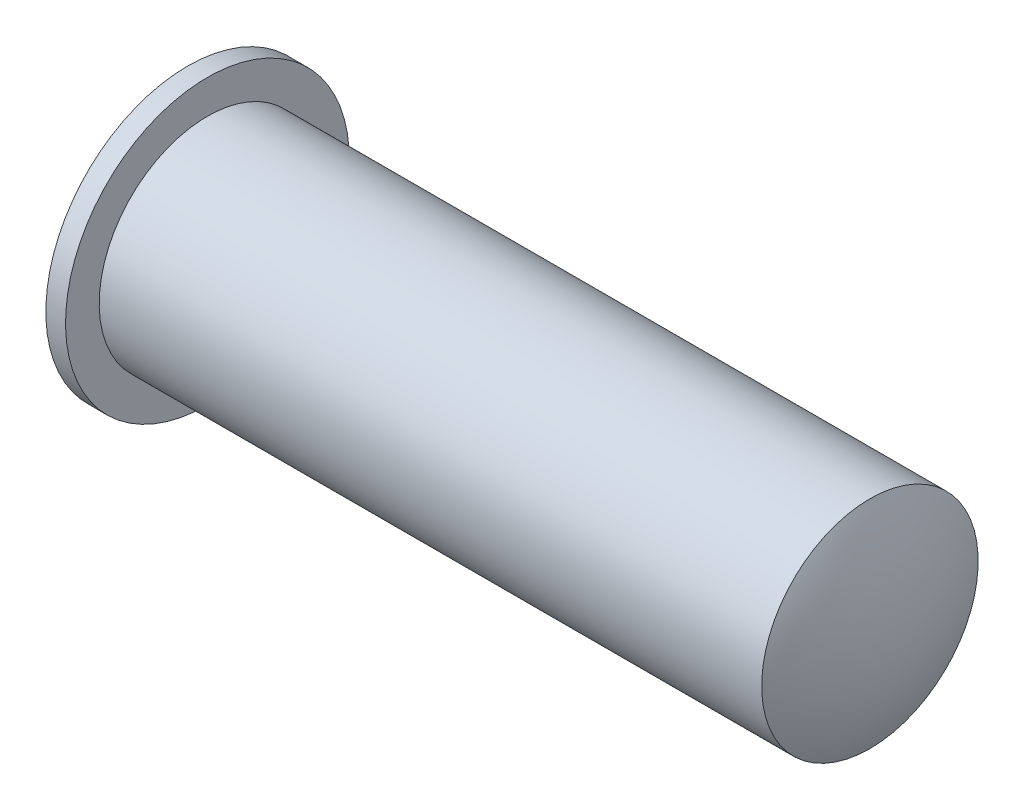
ISO-10303-21;
HEADER;
FILE_DESCRIPTION(('STEP AP214'),'2;1');
FILE_NAME('part.step','',(''),(''),'','','');
FILE_SCHEMA(('AUTOMOTIVE_DESIGN { 1 0 10303 214 1 1 1 1 }'));
ENDSEC;
DATA;
#1=APPLICATION_CONTEXT('core data for automotive mechanical design processes');
#2=APPLICATION_PROTOCOL_DEFINITION('international standard','automotive_design',2000,#1);
#3=PRODUCT_CONTEXT('',#1,'mechanical');
#4=PRODUCT('Part','Part','',(#3));
#5=PRODUCT_RELATED_PRODUCT_CATEGORY('part','',(#4));
#6=PRODUCT_DEFINITION_FORMATION('','',#4);
#7=PRODUCT_DEFINITION_CONTEXT('part definition',#1,'design');
#8=PRODUCT_DEFINITION('design','',#6,#7);
#9=PRODUCT_DEFINITION_SHAPE('','',#8);
#10=(LENGTH_UNIT() NAMED_UNIT(*) SI_UNIT(.MILLI.,.METRE.));
#11=(NAMED_UNIT(*) PLANE_ANGLE_UNIT() SI_UNIT($,.RADIAN.));
#12=(NAMED_UNIT(*) SI_UNIT($,.STERADIAN.) SOLID_ANGLE_UNIT());
#13=UNCERTAINTY_MEASURE_WITH_UNIT(LENGTH_MEASURE(1.E-05),#10,'distance_accuracy_value','');
#14=(GEOMETRIC_REPRESENTATION_CONTEXT(3) GLOBAL_UNCERTAINTY_ASSIGNED_CONTEXT((#13)) GLOBAL_UNIT_ASSIGNED_CONTEXT((#10,
#11,#12)) REPRESENTATION_CONTEXT('',''));
#15=CARTESIAN_POINT('',(0.,0.,0.));
#16=DIRECTION('',(0.,0.,1.));
#17=DIRECTION('',(1.,0.,0.));
#18=AXIS2_PLACEMENT_3D('',#15,#16,#17);
#19=CARTESIAN_POINT('',(12.,0.,0.));
#20=DIRECTION('',(-1.,0.,0.));
#21=DIRECTION('',(0.,1.,0.));
#22=AXIS2_PLACEMENT_3D('',#19,#20,#21);
#23=SPHERICAL_SURFACE('',#22,14.);
#24=CARTESIAN_POINT('',(0.,0.,0.));
#25=DIRECTION('',(-1.,0.,0.));
#26=DIRECTION('',(0.,-1.,0.));
#27=AXIS2_PLACEMENT_3D('',#24,#25,#26);
#28=CIRCLE('',#27,7.21110255092798);
#29=CARTESIAN_POINT('',(0.,-7.21110255092798,0.));
#30=VERTEX_POINT('',#29);
#31=EDGE_CURVE('E51',#30,#30,#28,.T.);
#32=ORIENTED_EDGE('',*,*,#31,.T.);
#33=EDGE_LOOP('',(#32));
#34=FACE_BOUND('',#33,.T.);
#35=ADVANCED_FACE('F37',(#34),#23,.T.);
#36=CARTESIAN_POINT('',(24.,0.,0.));
#37=DIRECTION('',(-1.,0.,0.));
#38=DIRECTION('',(0.,1.,0.));
#39=AXIS2_PLACEMENT_3D('',#36,#37,#38);
#40=SPHERICAL_SURFACE('',#39,12.);
#41=CARTESIAN_POINT('',(34.6653645038508,0.,0.));
#42=DIRECTION('',(-1.,0.,0.));
#43=DIRECTION('',(0.,-1.,0.));
#44=AXIS2_PLACEMENT_3D('',#41,#42,#43);
#45=CIRCLE('',#44,5.5);
#46=CARTESIAN_POINT('',(34.6653645038508,-5.5,0.));
#47=VERTEX_POINT('',#46);
#48=EDGE_CURVE('E10',#47,#47,#45,.T.);
#49=ORIENTED_EDGE('',*,*,#48,.F.);
#50=EDGE_LOOP('',(#49));
#51=FACE_BOUND('',#50,.T.);
#52=ADVANCED_FACE('F71',(#51),#40,.T.);
#53=CARTESIAN_POINT('',(-2.,0.,0.));
#54=DIRECTION('',(-1.,0.,0.));
#55=DIRECTION('',(0.,-1.,0.));
#56=AXIS2_PLACEMENT_3D('',#53,#54,#55);
#57=CYLINDRICAL_SURFACE('',#56,5.5);
#58=CARTESIAN_POINT('',(1.,0.,0.));
#59=DIRECTION('',(-1.,0.,0.));
#60=DIRECTION('',(0.,-1.,0.));
#61=AXIS2_PLACEMENT_3D('',#58,#59,#60);
#62=CIRCLE('',#61,5.5);
#63=CARTESIAN_POINT('',(1.,-5.5,0.));
#64=VERTEX_POINT('',#63);
#65=EDGE_CURVE('E43',#64,#64,#62,.T.);
#66=ORIENTED_EDGE('',*,*,#65,.F.);
#67=EDGE_LOOP('',(#66));
#68=FACE_BOUND('',#67,.T.);
#69=ORIENTED_EDGE('',*,*,#48,.T.);
#70=EDGE_LOOP('',(#69));
#71=FACE_BOUND('',#70,.T.);
#72=ADVANCED_FACE('F66',(#68,#71),#57,.T.);
#73=CARTESIAN_POINT('',(1.,7.21110255092798,0.));
#74=DIRECTION('',(-1.,0.,0.));
#75=DIRECTION('',(0.,-1.,0.));
#76=AXIS2_PLACEMENT_3D('',#73,#74,#75);
#77=PLANE('',#76);
#78=CARTESIAN_POINT('',(1.,0.,0.));
#79=DIRECTION('',(-1.,0.,0.));
#80=DIRECTION('',(0.,-1.,0.));
#81=AXIS2_PLACEMENT_3D('',#78,#79,#80);
#82=CIRCLE('',#81,7.21110255092798);
#83=CARTESIAN_POINT('',(1.,-7.21110255092798,0.));
#84=VERTEX_POINT('',#83);
#85=EDGE_CURVE('E47',#84,#84,#82,.T.);
#86=ORIENTED_EDGE('',*,*,#85,.F.);
#87=EDGE_LOOP('',(#86));
#88=FACE_BOUND('',#87,.T.);
#89=ORIENTED_EDGE('',*,*,#65,.T.);
#90=EDGE_LOOP('',(#89));
#91=FACE_BOUND('',#90,.T.);
#92=ADVANCED_FACE('F61',(#88,#91),#77,.F.);
#93=CARTESIAN_POINT('',(-2.,0.,0.));
#94=DIRECTION('',(-1.,0.,0.));
#95=DIRECTION('',(0.,-1.,0.));
#96=AXIS2_PLACEMENT_3D('',#93,#94,#95);
#97=CYLINDRICAL_SURFACE('',#96,7.21110255092798);
#98=ORIENTED_EDGE('',*,*,#31,.F.);
#99=EDGE_LOOP('',(#98));
#100=FACE_BOUND('',#99,.T.);
#101=ORIENTED_EDGE('',*,*,#85,.T.);
#102=EDGE_LOOP('',(#101));
#103=FACE_BOUND('',#102,.T.);
#104=ADVANCED_FACE('F58',(#100,#103),#97,.T.);
#105=CLOSED_SHELL('',(#35,#52,#72,#92,#104));
#106=MANIFOLD_SOLID_BREP('B2',#105);
#107=ADVANCED_BREP_SHAPE_REPRESENTATION('',(#18,#106),#14);
#108=SHAPE_DEFINITION_REPRESENTATION(#9,#107);
ENDSEC;
END-ISO-10303-21;
